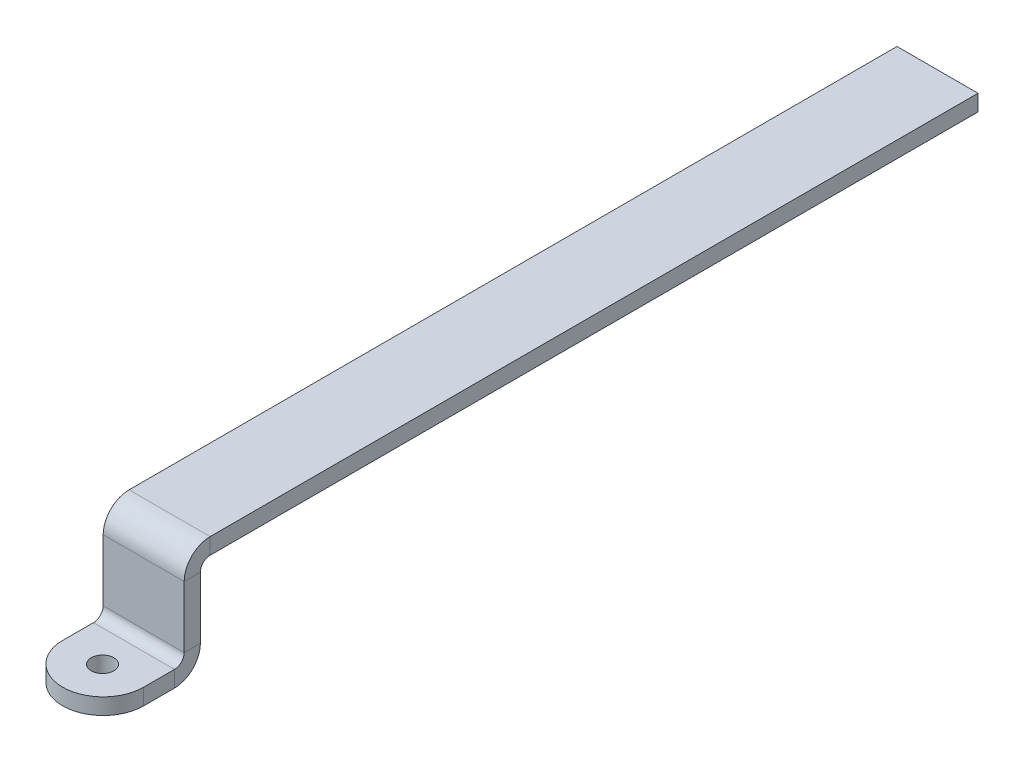
ISO-10303-21;
HEADER;
FILE_DESCRIPTION(('STEP AP214'),'2;1');
FILE_NAME('part.step','',(''),(''),'','','');
FILE_SCHEMA(('AUTOMOTIVE_DESIGN { 1 0 10303 214 1 1 1 1 }'));
ENDSEC;
DATA;
#1=APPLICATION_CONTEXT('core data for automotive mechanical design processes');
#2=APPLICATION_PROTOCOL_DEFINITION('international standard','automotive_design',2000,#1);
#3=PRODUCT_CONTEXT('',#1,'mechanical');
#4=PRODUCT('Part','Part','',(#3));
#5=PRODUCT_RELATED_PRODUCT_CATEGORY('part','',(#4));
#6=PRODUCT_DEFINITION_FORMATION('','',#4);
#7=PRODUCT_DEFINITION_CONTEXT('part definition',#1,'design');
#8=PRODUCT_DEFINITION('design','',#6,#7);
#9=PRODUCT_DEFINITION_SHAPE('','',#8);
#10=(LENGTH_UNIT() NAMED_UNIT(*) SI_UNIT(.MILLI.,.METRE.));
#11=(NAMED_UNIT(*) PLANE_ANGLE_UNIT() SI_UNIT($,.RADIAN.));
#12=(NAMED_UNIT(*) SI_UNIT($,.STERADIAN.) SOLID_ANGLE_UNIT());
#13=UNCERTAINTY_MEASURE_WITH_UNIT(LENGTH_MEASURE(1.E-05),#10,'distance_accuracy_value','');
#14=(GEOMETRIC_REPRESENTATION_CONTEXT(3) GLOBAL_UNCERTAINTY_ASSIGNED_CONTEXT((#13)) GLOBAL_UNIT_ASSIGNED_CONTEXT((#10,
#11,#12)) REPRESENTATION_CONTEXT('',''));
#15=CARTESIAN_POINT('',(0.,0.,0.));
#16=DIRECTION('',(0.,0.,1.));
#17=DIRECTION('',(1.,0.,0.));
#18=AXIS2_PLACEMENT_3D('',#15,#16,#17);
#19=CARTESIAN_POINT('',(0.,-1.25,0.875));
#20=DIRECTION('',(0.,1.,0.));
#21=DIRECTION('',(0.,0.,1.));
#22=AXIS2_PLACEMENT_3D('',#19,#20,#21);
#23=CYLINDRICAL_SURFACE('',#22,0.625);
#24=DIRECTION('',(0.,1.,0.));
#25=VECTOR('',#24,1.);
#26=CARTESIAN_POINT('',(0.625,-1.1,0.875));
#27=LINE('',#26,#25);
#28=CARTESIAN_POINT('',(0.625,-1.25,0.875));
#29=VERTEX_POINT('',#28);
#30=CARTESIAN_POINT('',(0.625,-1.5,0.875));
#31=VERTEX_POINT('',#30);
#32=EDGE_CURVE('E154',#29,#31,#27,.F.);
#33=ORIENTED_EDGE('',*,*,#32,.F.);
#34=CARTESIAN_POINT('',(0.,-1.25,0.875));
#35=DIRECTION('',(0.,-1.,0.));
#36=DIRECTION('',(0.,0.,-1.));
#37=AXIS2_PLACEMENT_3D('',#34,#35,#36);
#38=CIRCLE('',#37,0.625);
#39=CARTESIAN_POINT('',(-0.625,-1.25,0.875));
#40=VERTEX_POINT('',#39);
#41=EDGE_CURVE('E46',#40,#29,#38,.F.);
#42=ORIENTED_EDGE('',*,*,#41,.F.);
#43=DIRECTION('',(0.,-1.,0.));
#44=VECTOR('',#43,1.);
#45=CARTESIAN_POINT('',(-0.625,-1.25,0.875));
#46=LINE('',#45,#44);
#47=CARTESIAN_POINT('',(-0.625,-1.5,0.875));
#48=VERTEX_POINT('',#47);
#49=EDGE_CURVE('E250',#48,#40,#46,.F.);
#50=ORIENTED_EDGE('',*,*,#49,.F.);
#51=CARTESIAN_POINT('',(0.,-1.5,0.875));
#52=DIRECTION('',(0.,-1.,0.));
#53=DIRECTION('',(0.,0.,-1.));
#54=AXIS2_PLACEMENT_3D('',#51,#52,#53);
#55=CIRCLE('',#54,0.625);
#56=EDGE_CURVE('E11',#31,#48,#55,.T.);
#57=ORIENTED_EDGE('',*,*,#56,.F.);
#58=EDGE_LOOP('',(#33,#42,#50,#57));
#59=FACE_BOUND('',#58,.T.);
#60=ADVANCED_FACE('F38',(#59),#23,.T.);
#61=CARTESIAN_POINT('',(0.625,-0.15,0.));
#62=DIRECTION('',(1.,0.,0.));
#63=DIRECTION('',(0.,0.,-1.));
#64=AXIS2_PLACEMENT_3D('',#61,#62,#63);
#65=PLANE('',#64);
#66=DIRECTION('',(0.,0.,1.));
#67=VECTOR('',#66,1.);
#68=CARTESIAN_POINT('',(0.625,-0.15,0.));
#69=LINE('',#68,#67);
#70=CARTESIAN_POINT('',(0.625,-0.15,0.));
#71=VERTEX_POINT('',#70);
#72=CARTESIAN_POINT('',(0.625,-0.15,0.25));
#73=VERTEX_POINT('',#72);
#74=EDGE_CURVE('E247',#71,#73,#69,.T.);
#75=ORIENTED_EDGE('',*,*,#74,.F.);
#76=CARTESIAN_POINT('',(0.625,-0.15,-0.15));
#77=DIRECTION('',(-1.,0.,0.));
#78=DIRECTION('',(0.,0.,1.));
#79=AXIS2_PLACEMENT_3D('',#76,#77,#78);
#80=CIRCLE('',#79,0.15);
#81=CARTESIAN_POINT('',(0.625,0.,-0.150000000000001));
#82=VERTEX_POINT('',#81);
#83=EDGE_CURVE('E162',#82,#71,#80,.F.);
#84=ORIENTED_EDGE('',*,*,#83,.F.);
#85=DIRECTION('',(0.,-1.,0.));
#86=VECTOR('',#85,1.);
#87=CARTESIAN_POINT('',(0.625,0.25,-0.150000000000001));
#88=LINE('',#87,#86);
#89=CARTESIAN_POINT('',(0.625,0.25,-0.150000000000001));
#90=VERTEX_POINT('',#89);
#91=EDGE_CURVE('E245',#90,#82,#88,.T.);
#92=ORIENTED_EDGE('',*,*,#91,.F.);
#93=CARTESIAN_POINT('',(0.625,-0.15,-0.15));
#94=DIRECTION('',(1.,0.,0.));
#95=DIRECTION('',(0.,0.,-1.));
#96=AXIS2_PLACEMENT_3D('',#93,#94,#95);
#97=CIRCLE('',#96,0.4);
#98=EDGE_CURVE('E177',#90,#73,#97,.T.);
#99=ORIENTED_EDGE('',*,*,#98,.T.);
#100=EDGE_LOOP('',(#75,#84,#92,#99));
#101=FACE_BOUND('',#100,.T.);
#102=ADVANCED_FACE('F282',(#101),#65,.T.);
#103=CARTESIAN_POINT('',(0.625,0.25,-0.150000000000001));
#104=DIRECTION('',(1.,0.,0.));
#105=DIRECTION('',(0.,0.,-1.));
#106=AXIS2_PLACEMENT_3D('',#103,#104,#105);
#107=PLANE('',#106);
#108=DIRECTION('',(0.,-1.,0.));
#109=VECTOR('',#108,1.);
#110=CARTESIAN_POINT('',(0.625,0.,0.));
#111=LINE('',#110,#109);
#112=CARTESIAN_POINT('',(0.625,-1.1,0.));
#113=VERTEX_POINT('',#112);
#114=EDGE_CURVE('E160',#71,#113,#111,.T.);
#115=ORIENTED_EDGE('',*,*,#114,.F.);
#116=ORIENTED_EDGE('',*,*,#74,.T.);
#117=DIRECTION('',(0.,-1.,0.));
#118=VECTOR('',#117,1.);
#119=CARTESIAN_POINT('',(0.625,0.,0.25));
#120=LINE('',#119,#118);
#121=CARTESIAN_POINT('',(0.625,-1.1,0.25));
#122=VERTEX_POINT('',#121);
#123=EDGE_CURVE('E180',#73,#122,#120,.T.);
#124=ORIENTED_EDGE('',*,*,#123,.T.);
#125=DIRECTION('',(0.,0.,-1.));
#126=VECTOR('',#125,1.);
#127=CARTESIAN_POINT('',(0.625,-1.1,0.25));
#128=LINE('',#127,#126);
#129=EDGE_CURVE('E138',#122,#113,#128,.T.);
#130=ORIENTED_EDGE('',*,*,#129,.T.);
#131=EDGE_LOOP('',(#115,#116,#124,#130));
#132=FACE_BOUND('',#131,.T.);
#133=ADVANCED_FACE('F286',(#132),#107,.T.);
#134=CARTESIAN_POINT('',(-0.625,0.,-0.150000000000001));
#135=DIRECTION('',(-1.,0.,0.));
#136=DIRECTION('',(0.,0.,1.));
#137=AXIS2_PLACEMENT_3D('',#134,#135,#136);
#138=PLANE('',#137);
#139=DIRECTION('',(0.,1.,0.));
#140=VECTOR('',#139,1.);
#141=CARTESIAN_POINT('',(-0.625,0.,-0.150000000000001));
#142=LINE('',#141,#140);
#143=CARTESIAN_POINT('',(-0.625,0.,-0.150000000000001));
#144=VERTEX_POINT('',#143);
#145=CARTESIAN_POINT('',(-0.625,0.25,-0.150000000000001));
#146=VERTEX_POINT('',#145);
#147=EDGE_CURVE('E243',#144,#146,#142,.T.);
#148=ORIENTED_EDGE('',*,*,#147,.F.);
#149=CARTESIAN_POINT('',(-0.625,-0.15,-0.15));
#150=DIRECTION('',(-1.,0.,0.));
#151=DIRECTION('',(0.,0.,1.));
#152=AXIS2_PLACEMENT_3D('',#149,#150,#151);
#153=CIRCLE('',#152,0.15);
#154=CARTESIAN_POINT('',(-0.625,-0.15,0.));
#155=VERTEX_POINT('',#154);
#156=EDGE_CURVE('E195',#144,#155,#153,.F.);
#157=ORIENTED_EDGE('',*,*,#156,.T.);
#158=DIRECTION('',(0.,0.,-1.));
#159=VECTOR('',#158,1.);
#160=CARTESIAN_POINT('',(-0.625,-0.15,0.25));
#161=LINE('',#160,#159);
#162=CARTESIAN_POINT('',(-0.625,-0.15,0.25));
#163=VERTEX_POINT('',#162);
#164=EDGE_CURVE('E137',#163,#155,#161,.T.);
#165=ORIENTED_EDGE('',*,*,#164,.F.);
#166=CARTESIAN_POINT('',(-0.625,-0.15,-0.15));
#167=DIRECTION('',(1.,0.,0.));
#168=DIRECTION('',(0.,0.,-1.));
#169=AXIS2_PLACEMENT_3D('',#166,#167,#168);
#170=CIRCLE('',#169,0.4);
#171=EDGE_CURVE('E207',#146,#163,#170,.T.);
#172=ORIENTED_EDGE('',*,*,#171,.F.);
#173=EDGE_LOOP('',(#148,#157,#165,#172));
#174=FACE_BOUND('',#173,.T.);
#175=ADVANCED_FACE('F291',(#174),#138,.T.);
#176=CARTESIAN_POINT('',(-0.625,-0.15,0.25));
#177=DIRECTION('',(-1.,0.,0.));
#178=DIRECTION('',(0.,0.,1.));
#179=AXIS2_PLACEMENT_3D('',#176,#177,#178);
#180=PLANE('',#179);
#181=DIRECTION('',(0.,0.,1.));
#182=VECTOR('',#181,1.);
#183=CARTESIAN_POINT('',(-0.625,0.,-12.));
#184=LINE('',#183,#182);
#185=CARTESIAN_POINT('',(-0.625,0.,-12.));
#186=VERTEX_POINT('',#185);
#187=EDGE_CURVE('E198',#186,#144,#184,.T.);
#188=ORIENTED_EDGE('',*,*,#187,.T.);
#189=ORIENTED_EDGE('',*,*,#147,.T.);
#190=DIRECTION('',(0.,0.,-1.));
#191=VECTOR('',#190,1.);
#192=CARTESIAN_POINT('',(-0.625,0.25,-12.));
#193=LINE('',#192,#191);
#194=CARTESIAN_POINT('',(-0.625,0.25,-12.));
#195=VERTEX_POINT('',#194);
#196=EDGE_CURVE('E204',#195,#146,#193,.F.);
#197=ORIENTED_EDGE('',*,*,#196,.F.);
#198=DIRECTION('',(0.,-1.,0.));
#199=VECTOR('',#198,1.);
#200=CARTESIAN_POINT('',(-0.625,0.25,-12.));
#201=LINE('',#200,#199);
#202=EDGE_CURVE('E201',#195,#186,#201,.T.);
#203=ORIENTED_EDGE('',*,*,#202,.T.);
#204=EDGE_LOOP('',(#188,#189,#197,#203));
#205=FACE_BOUND('',#204,.T.);
#206=ADVANCED_FACE('F297',(#205),#180,.T.);
#207=CARTESIAN_POINT('',(0.625,-1.5,0.4));
#208=DIRECTION('',(1.,0.,0.));
#209=DIRECTION('',(0.,0.,-1.));
#210=AXIS2_PLACEMENT_3D('',#207,#208,#209);
#211=PLANE('',#210);
#212=DIRECTION('',(0.,1.,0.));
#213=VECTOR('',#212,1.);
#214=CARTESIAN_POINT('',(0.625,-1.5,0.4));
#215=LINE('',#214,#213);
#216=CARTESIAN_POINT('',(0.625,-1.5,0.4));
#217=VERTEX_POINT('',#216);
#218=CARTESIAN_POINT('',(0.625,-1.25,0.4));
#219=VERTEX_POINT('',#218);
#220=EDGE_CURVE('E125',#217,#219,#215,.T.);
#221=ORIENTED_EDGE('',*,*,#220,.F.);
#222=CARTESIAN_POINT('',(0.625,-1.1,0.4));
#223=DIRECTION('',(1.,0.,0.));
#224=DIRECTION('',(0.,0.,-1.));
#225=AXIS2_PLACEMENT_3D('',#222,#223,#224);
#226=CIRCLE('',#225,0.4);
#227=EDGE_CURVE('E129',#113,#217,#226,.F.);
#228=ORIENTED_EDGE('',*,*,#227,.F.);
#229=ORIENTED_EDGE('',*,*,#129,.F.);
#230=CARTESIAN_POINT('',(0.625,-1.1,0.4));
#231=DIRECTION('',(1.,0.,0.));
#232=DIRECTION('',(0.,0.,-1.));
#233=AXIS2_PLACEMENT_3D('',#230,#231,#232);
#234=CIRCLE('',#233,0.15);
#235=EDGE_CURVE('E132',#122,#219,#234,.F.);
#236=ORIENTED_EDGE('',*,*,#235,.T.);
#237=EDGE_LOOP('',(#221,#228,#229,#236));
#238=FACE_BOUND('',#237,.T.);
#239=ADVANCED_FACE('F127',(#238),#211,.T.);
#240=CARTESIAN_POINT('',(0.625,-1.1,0.25));
#241=DIRECTION('',(1.,0.,0.));
#242=DIRECTION('',(0.,0.,-1.));
#243=AXIS2_PLACEMENT_3D('',#240,#241,#242);
#244=PLANE('',#243);
#245=DIRECTION('',(0.,0.,1.));
#246=VECTOR('',#245,1.);
#247=CARTESIAN_POINT('',(0.625,-1.25,0.));
#248=LINE('',#247,#246);
#249=EDGE_CURVE('E155',#219,#29,#248,.T.);
#250=ORIENTED_EDGE('',*,*,#249,.T.);
#251=ORIENTED_EDGE('',*,*,#32,.T.);
#252=DIRECTION('',(0.,0.,1.));
#253=VECTOR('',#252,1.);
#254=CARTESIAN_POINT('',(0.625,-1.5,0.));
#255=LINE('',#254,#253);
#256=EDGE_CURVE('E143',#217,#31,#255,.T.);
#257=ORIENTED_EDGE('',*,*,#256,.F.);
#258=ORIENTED_EDGE('',*,*,#220,.T.);
#259=EDGE_LOOP('',(#250,#251,#257,#258));
#260=FACE_BOUND('',#259,.T.);
#261=ADVANCED_FACE('F153',(#260),#244,.T.);
#262=CARTESIAN_POINT('',(-0.625,-1.1,0.));
#263=DIRECTION('',(-1.,0.,0.));
#264=DIRECTION('',(0.,0.,1.));
#265=AXIS2_PLACEMENT_3D('',#262,#263,#264);
#266=PLANE('',#265);
#267=DIRECTION('',(0.,0.,1.));
#268=VECTOR('',#267,1.);
#269=CARTESIAN_POINT('',(-0.625,-1.1,0.));
#270=LINE('',#269,#268);
#271=CARTESIAN_POINT('',(-0.625,-1.1,0.));
#272=VERTEX_POINT('',#271);
#273=CARTESIAN_POINT('',(-0.625,-1.1,0.25));
#274=VERTEX_POINT('',#273);
#275=EDGE_CURVE('E239',#272,#274,#270,.T.);
#276=ORIENTED_EDGE('',*,*,#275,.F.);
#277=CARTESIAN_POINT('',(-0.625,-1.1,0.4));
#278=DIRECTION('',(1.,0.,0.));
#279=DIRECTION('',(0.,0.,-1.));
#280=AXIS2_PLACEMENT_3D('',#277,#278,#279);
#281=CIRCLE('',#280,0.4);
#282=CARTESIAN_POINT('',(-0.625,-1.5,0.4));
#283=VERTEX_POINT('',#282);
#284=EDGE_CURVE('E190',#272,#283,#281,.F.);
#285=ORIENTED_EDGE('',*,*,#284,.T.);
#286=DIRECTION('',(0.,-1.,0.));
#287=VECTOR('',#286,1.);
#288=CARTESIAN_POINT('',(-0.625,-1.25,0.4));
#289=LINE('',#288,#287);
#290=CARTESIAN_POINT('',(-0.625,-1.25,0.4));
#291=VERTEX_POINT('',#290);
#292=EDGE_CURVE('E149',#291,#283,#289,.T.);
#293=ORIENTED_EDGE('',*,*,#292,.F.);
#294=CARTESIAN_POINT('',(-0.625,-1.1,0.4));
#295=DIRECTION('',(1.,0.,0.));
#296=DIRECTION('',(0.,0.,-1.));
#297=AXIS2_PLACEMENT_3D('',#294,#295,#296);
#298=CIRCLE('',#297,0.15);
#299=EDGE_CURVE('E213',#274,#291,#298,.F.);
#300=ORIENTED_EDGE('',*,*,#299,.F.);
#301=EDGE_LOOP('',(#276,#285,#293,#300));
#302=FACE_BOUND('',#301,.T.);
#303=ADVANCED_FACE('F278',(#302),#266,.T.);
#304=CARTESIAN_POINT('',(-0.625,-1.25,0.4));
#305=DIRECTION('',(-1.,0.,0.));
#306=DIRECTION('',(0.,0.,1.));
#307=AXIS2_PLACEMENT_3D('',#304,#305,#306);
#308=PLANE('',#307);
#309=DIRECTION('',(0.,-1.,0.));
#310=VECTOR('',#309,1.);
#311=CARTESIAN_POINT('',(-0.625,0.,0.));
#312=LINE('',#311,#310);
#313=EDGE_CURVE('E192',#155,#272,#312,.T.);
#314=ORIENTED_EDGE('',*,*,#313,.T.);
#315=ORIENTED_EDGE('',*,*,#275,.T.);
#316=DIRECTION('',(0.,-1.,0.));
#317=VECTOR('',#316,1.);
#318=CARTESIAN_POINT('',(-0.625,0.,0.25));
#319=LINE('',#318,#317);
#320=EDGE_CURVE('E210',#163,#274,#319,.T.);
#321=ORIENTED_EDGE('',*,*,#320,.F.);
#322=ORIENTED_EDGE('',*,*,#164,.T.);
#323=EDGE_LOOP('',(#314,#315,#321,#322));
#324=FACE_BOUND('',#323,.T.);
#325=ADVANCED_FACE('F271',(#324),#308,.T.);
#326=CARTESIAN_POINT('',(0.625,-1.25,0.));
#327=DIRECTION('',(0.,-1.,0.));
#328=DIRECTION('',(0.,0.,-1.));
#329=AXIS2_PLACEMENT_3D('',#326,#327,#328);
#330=PLANE('',#329);
#331=CARTESIAN_POINT('',(0.00147138158428962,-1.25000000002728,0.886025874251898));
#332=DIRECTION('',(0.,1.,0.));
#333=DIRECTION('',(0.,0.,1.));
#334=AXIS2_PLACEMENT_3D('',#331,#332,#333);
#335=CIRCLE('',#334,0.175);
#336=CARTESIAN_POINT('',(0.00147138158428962,-1.25000000002728,1.0610258742519));
#337=VERTEX_POINT('',#336);
#338=EDGE_CURVE('E256',#337,#337,#335,.T.);
#339=ORIENTED_EDGE('',*,*,#338,.F.);
#340=EDGE_LOOP('',(#339));
#341=FACE_BOUND('',#340,.T.);
#342=DIRECTION('',(0.,0.,1.));
#343=VECTOR('',#342,1.);
#344=CARTESIAN_POINT('',(-0.625,-1.25,0.));
#345=LINE('',#344,#343);
#346=EDGE_CURVE('E185',#291,#40,#345,.T.);
#347=ORIENTED_EDGE('',*,*,#346,.T.);
#348=ORIENTED_EDGE('',*,*,#41,.T.);
#349=ORIENTED_EDGE('',*,*,#249,.F.);
#350=DIRECTION('',(-1.,0.,0.));
#351=VECTOR('',#350,1.);
#352=CARTESIAN_POINT('',(0.625,-1.25,0.4));
#353=LINE('',#352,#351);
#354=EDGE_CURVE('E184',#219,#291,#353,.T.);
#355=ORIENTED_EDGE('',*,*,#354,.T.);
#356=EDGE_LOOP('',(#347,#348,#349,#355));
#357=FACE_BOUND('',#356,.T.);
#358=ADVANCED_FACE('F253',(#341,#357),#330,.F.);
#359=CARTESIAN_POINT('',(0.625,-1.5,0.));
#360=DIRECTION('',(0.,-1.,0.));
#361=DIRECTION('',(0.,0.,-1.));
#362=AXIS2_PLACEMENT_3D('',#359,#360,#361);
#363=PLANE('',#362);
#364=CARTESIAN_POINT('',(0.00147138158428962,-1.5,0.886025874251898));
#365=DIRECTION('',(0.,1.,0.));
#366=DIRECTION('',(0.,0.,1.));
#367=AXIS2_PLACEMENT_3D('',#364,#365,#366);
#368=CIRCLE('',#367,0.175);
#369=CARTESIAN_POINT('',(0.00147138158428962,-1.5,1.0610258742519));
#370=VERTEX_POINT('',#369);
#371=EDGE_CURVE('E188',#370,#370,#368,.T.);
#372=ORIENTED_EDGE('',*,*,#371,.T.);
#373=EDGE_LOOP('',(#372));
#374=FACE_BOUND('',#373,.T.);
#375=ORIENTED_EDGE('',*,*,#256,.T.);
#376=ORIENTED_EDGE('',*,*,#56,.T.);
#377=DIRECTION('',(0.,0.,1.));
#378=VECTOR('',#377,1.);
#379=CARTESIAN_POINT('',(-0.625,-1.5,0.));
#380=LINE('',#379,#378);
#381=EDGE_CURVE('E145',#283,#48,#380,.T.);
#382=ORIENTED_EDGE('',*,*,#381,.F.);
#383=DIRECTION('',(-1.,0.,0.));
#384=VECTOR('',#383,1.);
#385=CARTESIAN_POINT('',(0.625,-1.5,0.4));
#386=LINE('',#385,#384);
#387=EDGE_CURVE('E141',#217,#283,#386,.T.);
#388=ORIENTED_EDGE('',*,*,#387,.F.);
#389=EDGE_LOOP('',(#375,#376,#382,#388));
#390=FACE_BOUND('',#389,.T.);
#391=ADVANCED_FACE('F142',(#374,#390),#363,.T.);
#392=CARTESIAN_POINT('',(0.625,-1.1,0.4));
#393=DIRECTION('',(-1.,0.,0.));
#394=DIRECTION('',(0.,0.,1.));
#395=AXIS2_PLACEMENT_3D('',#392,#393,#394);
#396=CYLINDRICAL_SURFACE('',#395,0.4);
#397=ORIENTED_EDGE('',*,*,#284,.F.);
#398=DIRECTION('',(-1.,0.,0.));
#399=VECTOR('',#398,1.);
#400=CARTESIAN_POINT('',(0.625,-1.1,0.));
#401=LINE('',#400,#399);
#402=EDGE_CURVE('E150',#113,#272,#401,.T.);
#403=ORIENTED_EDGE('',*,*,#402,.F.);
#404=ORIENTED_EDGE('',*,*,#227,.T.);
#405=ORIENTED_EDGE('',*,*,#387,.T.);
#406=EDGE_LOOP('',(#397,#403,#404,#405));
#407=FACE_BOUND('',#406,.T.);
#408=ADVANCED_FACE('F158',(#407),#396,.T.);
#409=CARTESIAN_POINT('',(0.625,0.,0.));
#410=DIRECTION('',(0.,0.,-1.));
#411=DIRECTION('',(0.,1.,0.));
#412=AXIS2_PLACEMENT_3D('',#409,#410,#411);
#413=PLANE('',#412);
#414=ORIENTED_EDGE('',*,*,#313,.F.);
#415=DIRECTION('',(-1.,0.,0.));
#416=VECTOR('',#415,1.);
#417=CARTESIAN_POINT('',(0.625,-0.15,0.));
#418=LINE('',#417,#416);
#419=EDGE_CURVE('E234',#71,#155,#418,.T.);
#420=ORIENTED_EDGE('',*,*,#419,.F.);
#421=ORIENTED_EDGE('',*,*,#114,.T.);
#422=ORIENTED_EDGE('',*,*,#402,.T.);
#423=EDGE_LOOP('',(#414,#420,#421,#422));
#424=FACE_BOUND('',#423,.T.);
#425=ADVANCED_FACE('F314',(#424),#413,.T.);
#426=CARTESIAN_POINT('',(0.625,-0.15,-0.15));
#427=DIRECTION('',(-1.,0.,0.));
#428=DIRECTION('',(0.,0.,1.));
#429=AXIS2_PLACEMENT_3D('',#426,#427,#428);
#430=CYLINDRICAL_SURFACE('',#429,0.15);
#431=ORIENTED_EDGE('',*,*,#156,.F.);
#432=DIRECTION('',(-1.,0.,0.));
#433=VECTOR('',#432,1.);
#434=CARTESIAN_POINT('',(0.625,0.,-0.150000000000001));
#435=LINE('',#434,#433);
#436=EDGE_CURVE('E231',#82,#144,#435,.T.);
#437=ORIENTED_EDGE('',*,*,#436,.F.);
#438=ORIENTED_EDGE('',*,*,#83,.T.);
#439=ORIENTED_EDGE('',*,*,#419,.T.);
#440=EDGE_LOOP('',(#431,#437,#438,#439));
#441=FACE_BOUND('',#440,.T.);
#442=ADVANCED_FACE('F320',(#441),#430,.F.);
#443=CARTESIAN_POINT('',(0.625,0.,-12.));
#444=DIRECTION('',(0.,-1.,0.));
#445=DIRECTION('',(0.,0.,-1.));
#446=AXIS2_PLACEMENT_3D('',#443,#444,#445);
#447=PLANE('',#446);
#448=ORIENTED_EDGE('',*,*,#187,.F.);
#449=DIRECTION('',(-1.,0.,0.));
#450=VECTOR('',#449,1.);
#451=CARTESIAN_POINT('',(0.625,0.,-12.));
#452=LINE('',#451,#450);
#453=CARTESIAN_POINT('',(0.625,0.,-12.));
#454=VERTEX_POINT('',#453);
#455=EDGE_CURVE('E229',#454,#186,#452,.T.);
#456=ORIENTED_EDGE('',*,*,#455,.F.);
#457=DIRECTION('',(0.,0.,1.));
#458=VECTOR('',#457,1.);
#459=CARTESIAN_POINT('',(0.625,0.,-12.));
#460=LINE('',#459,#458);
#461=EDGE_CURVE('E168',#454,#82,#460,.T.);
#462=ORIENTED_EDGE('',*,*,#461,.T.);
#463=ORIENTED_EDGE('',*,*,#436,.T.);
#464=EDGE_LOOP('',(#448,#456,#462,#463));
#465=FACE_BOUND('',#464,.T.);
#466=ADVANCED_FACE('F354',(#465),#447,.T.);
#467=CARTESIAN_POINT('',(0.625,0.25,-12.));
#468=DIRECTION('',(0.,0.,-1.));
#469=DIRECTION('',(-1.,0.,0.));
#470=AXIS2_PLACEMENT_3D('',#467,#468,#469);
#471=PLANE('',#470);
#472=ORIENTED_EDGE('',*,*,#202,.F.);
#473=DIRECTION('',(-1.,0.,0.));
#474=VECTOR('',#473,1.);
#475=CARTESIAN_POINT('',(0.625,0.25,-12.));
#476=LINE('',#475,#474);
#477=CARTESIAN_POINT('',(0.625,0.25,-12.));
#478=VERTEX_POINT('',#477);
#479=EDGE_CURVE('E227',#478,#195,#476,.T.);
#480=ORIENTED_EDGE('',*,*,#479,.F.);
#481=DIRECTION('',(0.,-1.,0.));
#482=VECTOR('',#481,1.);
#483=CARTESIAN_POINT('',(0.625,0.25,-12.));
#484=LINE('',#483,#482);
#485=EDGE_CURVE('E171',#478,#454,#484,.T.);
#486=ORIENTED_EDGE('',*,*,#485,.T.);
#487=ORIENTED_EDGE('',*,*,#455,.T.);
#488=EDGE_LOOP('',(#472,#480,#486,#487));
#489=FACE_BOUND('',#488,.T.);
#490=ADVANCED_FACE('F350',(#489),#471,.T.);
#491=CARTESIAN_POINT('',(0.625,0.25,-12.));
#492=DIRECTION('',(0.,-1.,0.));
#493=DIRECTION('',(0.,0.,-1.));
#494=AXIS2_PLACEMENT_3D('',#491,#492,#493);
#495=PLANE('',#494);
#496=ORIENTED_EDGE('',*,*,#196,.T.);
#497=DIRECTION('',(-1.,0.,0.));
#498=VECTOR('',#497,1.);
#499=CARTESIAN_POINT('',(0.625,0.25,-0.150000000000001));
#500=LINE('',#499,#498);
#501=EDGE_CURVE('E224',#90,#146,#500,.T.);
#502=ORIENTED_EDGE('',*,*,#501,.F.);
#503=DIRECTION('',(0.,0.,-1.));
#504=VECTOR('',#503,1.);
#505=CARTESIAN_POINT('',(0.625,0.25,-12.));
#506=LINE('',#505,#504);
#507=EDGE_CURVE('E174',#478,#90,#506,.F.);
#508=ORIENTED_EDGE('',*,*,#507,.F.);
#509=ORIENTED_EDGE('',*,*,#479,.T.);
#510=EDGE_LOOP('',(#496,#502,#508,#509));
#511=FACE_BOUND('',#510,.T.);
#512=ADVANCED_FACE('F346',(#511),#495,.F.);
#513=CARTESIAN_POINT('',(0.625,-0.15,-0.15));
#514=DIRECTION('',(-1.,0.,0.));
#515=DIRECTION('',(0.,0.,1.));
#516=AXIS2_PLACEMENT_3D('',#513,#514,#515);
#517=CYLINDRICAL_SURFACE('',#516,0.4);
#518=ORIENTED_EDGE('',*,*,#171,.T.);
#519=DIRECTION('',(-1.,0.,0.));
#520=VECTOR('',#519,1.);
#521=CARTESIAN_POINT('',(0.625,-0.15,0.25));
#522=LINE('',#521,#520);
#523=EDGE_CURVE('E221',#73,#163,#522,.T.);
#524=ORIENTED_EDGE('',*,*,#523,.F.);
#525=ORIENTED_EDGE('',*,*,#98,.F.);
#526=ORIENTED_EDGE('',*,*,#501,.T.);
#527=EDGE_LOOP('',(#518,#524,#525,#526));
#528=FACE_BOUND('',#527,.T.);
#529=ADVANCED_FACE('F343',(#528),#517,.T.);
#530=CARTESIAN_POINT('',(0.625,0.,0.25));
#531=DIRECTION('',(0.,0.,-1.));
#532=DIRECTION('',(0.,1.,0.));
#533=AXIS2_PLACEMENT_3D('',#530,#531,#532);
#534=PLANE('',#533);
#535=ORIENTED_EDGE('',*,*,#320,.T.);
#536=DIRECTION('',(-1.,0.,0.));
#537=VECTOR('',#536,1.);
#538=CARTESIAN_POINT('',(0.625,-1.1,0.25));
#539=LINE('',#538,#537);
#540=EDGE_CURVE('E218',#122,#274,#539,.T.);
#541=ORIENTED_EDGE('',*,*,#540,.F.);
#542=ORIENTED_EDGE('',*,*,#123,.F.);
#543=ORIENTED_EDGE('',*,*,#523,.T.);
#544=EDGE_LOOP('',(#535,#541,#542,#543));
#545=FACE_BOUND('',#544,.T.);
#546=ADVANCED_FACE('F326',(#545),#534,.F.);
#547=CARTESIAN_POINT('',(0.625,-1.1,0.4));
#548=DIRECTION('',(-1.,0.,0.));
#549=DIRECTION('',(0.,0.,1.));
#550=AXIS2_PLACEMENT_3D('',#547,#548,#549);
#551=CYLINDRICAL_SURFACE('',#550,0.15);
#552=ORIENTED_EDGE('',*,*,#299,.T.);
#553=ORIENTED_EDGE('',*,*,#354,.F.);
#554=ORIENTED_EDGE('',*,*,#235,.F.);
#555=ORIENTED_EDGE('',*,*,#540,.T.);
#556=EDGE_LOOP('',(#552,#553,#554,#555));
#557=FACE_BOUND('',#556,.T.);
#558=ADVANCED_FACE('F328',(#557),#551,.F.);
#559=CARTESIAN_POINT('',(0.625,-1.1,0.4));
#560=DIRECTION('',(1.,0.,0.));
#561=DIRECTION('',(0.,0.,-1.));
#562=AXIS2_PLACEMENT_3D('',#559,#560,#561);
#563=PLANE('',#562);
#564=ORIENTED_EDGE('',*,*,#507,.T.);
#565=ORIENTED_EDGE('',*,*,#91,.T.);
#566=ORIENTED_EDGE('',*,*,#461,.F.);
#567=ORIENTED_EDGE('',*,*,#485,.F.);
#568=EDGE_LOOP('',(#564,#565,#566,#567));
#569=FACE_BOUND('',#568,.T.);
#570=ADVANCED_FACE('F331',(#569),#563,.T.);
#571=CARTESIAN_POINT('',(-0.625,-1.1,0.4));
#572=DIRECTION('',(1.,0.,0.));
#573=DIRECTION('',(0.,0.,-1.));
#574=AXIS2_PLACEMENT_3D('',#571,#572,#573);
#575=PLANE('',#574);
#576=ORIENTED_EDGE('',*,*,#381,.T.);
#577=ORIENTED_EDGE('',*,*,#49,.T.);
#578=ORIENTED_EDGE('',*,*,#346,.F.);
#579=ORIENTED_EDGE('',*,*,#292,.T.);
#580=EDGE_LOOP('',(#576,#577,#578,#579));
#581=FACE_BOUND('',#580,.T.);
#582=ADVANCED_FACE('F266',(#581),#575,.F.);
#583=CARTESIAN_POINT('',(0.00147138158428962,-1.5,0.886025874251898));
#584=DIRECTION('',(0.,1.,0.));
#585=DIRECTION('',(0.,0.,1.));
#586=AXIS2_PLACEMENT_3D('',#583,#584,#585);
#587=CYLINDRICAL_SURFACE('',#586,0.175);
#588=ORIENTED_EDGE('',*,*,#371,.F.);
#589=EDGE_LOOP('',(#588));
#590=FACE_BOUND('',#589,.T.);
#591=ORIENTED_EDGE('',*,*,#338,.T.);
#592=EDGE_LOOP('',(#591));
#593=FACE_BOUND('',#592,.T.);
#594=ADVANCED_FACE('F263',(#590,#593),#587,.F.);
#595=CLOSED_SHELL('',(#60,#102,#133,#175,#206,#239,#261,#303,#325,#358,#391,#408,#425,#442,#466,
#490,#512,#529,#546,#558,#570,#582,#594));
#596=MANIFOLD_SOLID_BREP('B2',#595);
#597=ADVANCED_BREP_SHAPE_REPRESENTATION('',(#18,#596),#14);
#598=SHAPE_DEFINITION_REPRESENTATION(#9,#597);
ENDSEC;
END-ISO-10303-21;
